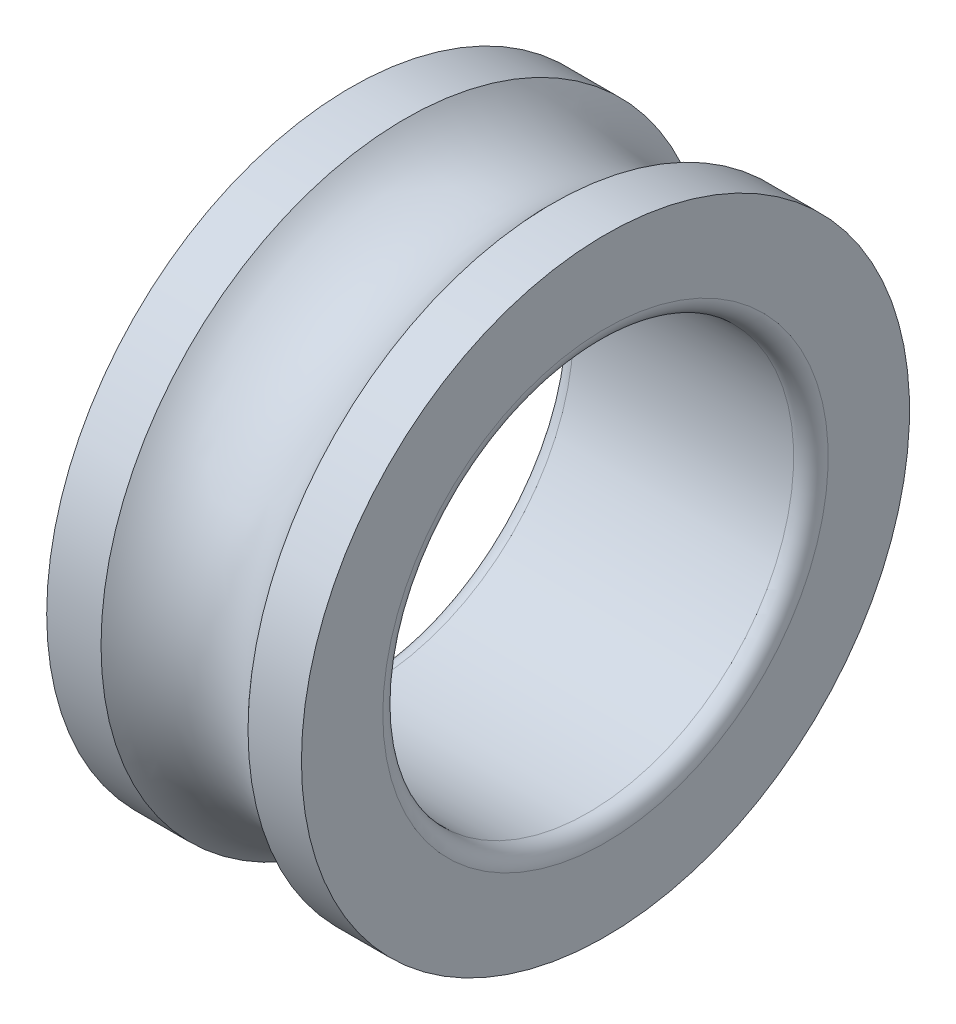
ISO-10303-21;
HEADER;
FILE_DESCRIPTION(('STEP AP214'),'2;1');
FILE_NAME('part.step','',(''),(''),'','','');
FILE_SCHEMA(('AUTOMOTIVE_DESIGN { 1 0 10303 214 1 1 1 1 }'));
ENDSEC;
DATA;
#1=APPLICATION_CONTEXT('core data for automotive mechanical design processes');
#2=APPLICATION_PROTOCOL_DEFINITION('international standard','automotive_design',2000,#1);
#3=PRODUCT_CONTEXT('',#1,'mechanical');
#4=PRODUCT('Part','Part','',(#3));
#5=PRODUCT_RELATED_PRODUCT_CATEGORY('part','',(#4));
#6=PRODUCT_DEFINITION_FORMATION('','',#4);
#7=PRODUCT_DEFINITION_CONTEXT('part definition',#1,'design');
#8=PRODUCT_DEFINITION('design','',#6,#7);
#9=PRODUCT_DEFINITION_SHAPE('','',#8);
#10=(LENGTH_UNIT() NAMED_UNIT(*) SI_UNIT(.MILLI.,.METRE.));
#11=(NAMED_UNIT(*) PLANE_ANGLE_UNIT() SI_UNIT($,.RADIAN.));
#12=(NAMED_UNIT(*) SI_UNIT($,.STERADIAN.) SOLID_ANGLE_UNIT());
#13=UNCERTAINTY_MEASURE_WITH_UNIT(LENGTH_MEASURE(1.E-05),#10,'distance_accuracy_value','');
#14=(GEOMETRIC_REPRESENTATION_CONTEXT(3) GLOBAL_UNCERTAINTY_ASSIGNED_CONTEXT((#13)) GLOBAL_UNIT_ASSIGNED_CONTEXT((#10,
#11,#12)) REPRESENTATION_CONTEXT('',''));
#15=CARTESIAN_POINT('',(0.,0.,0.));
#16=DIRECTION('',(0.,0.,1.));
#17=DIRECTION('',(1.,0.,0.));
#18=AXIS2_PLACEMENT_3D('',#15,#16,#17);
#19=CARTESIAN_POINT('',(-15.5,37.,0.));
#20=DIRECTION('',(1.,0.,0.));
#21=DIRECTION('',(0.,0.,-1.));
#22=AXIS2_PLACEMENT_3D('',#19,#20,#21);
#23=PLANE('',#22);
#24=CARTESIAN_POINT('',(-15.5,0.,0.));
#25=DIRECTION('',(-1.,0.,0.));
#26=DIRECTION('',(0.,0.,1.));
#27=AXIS2_PLACEMENT_3D('',#24,#25,#26);
#28=CIRCLE('',#27,27.1);
#29=CARTESIAN_POINT('',(-15.5,0.,27.1));
#30=VERTEX_POINT('',#29);
#31=EDGE_CURVE('E10',#30,#30,#28,.T.);
#32=ORIENTED_EDGE('',*,*,#31,.F.);
#33=EDGE_LOOP('',(#32));
#34=FACE_BOUND('',#33,.T.);
#35=CARTESIAN_POINT('',(-15.5,0.,0.));
#36=DIRECTION('',(-1.,0.,0.));
#37=DIRECTION('',(0.,0.,1.));
#38=AXIS2_PLACEMENT_3D('',#35,#36,#37);
#39=CIRCLE('',#38,37.);
#40=CARTESIAN_POINT('',(-15.5,0.,37.));
#41=VERTEX_POINT('',#40);
#42=EDGE_CURVE('E67',#41,#41,#39,.T.);
#43=ORIENTED_EDGE('',*,*,#42,.T.);
#44=EDGE_LOOP('',(#43));
#45=FACE_BOUND('',#44,.T.);
#46=ADVANCED_FACE('F39',(#34,#45),#23,.F.);
#47=CARTESIAN_POINT('',(-13.4,0.,0.));
#48=DIRECTION('',(-1.,0.,0.));
#49=DIRECTION('',(0.,0.,1.));
#50=AXIS2_PLACEMENT_3D('',#47,#48,#49);
#51=TOROIDAL_SURFACE('',#50,27.1,2.1);
#52=CARTESIAN_POINT('',(-13.4,0.,0.));
#53=DIRECTION('',(-1.,0.,0.));
#54=DIRECTION('',(0.,0.,1.));
#55=AXIS2_PLACEMENT_3D('',#52,#53,#54);
#56=CIRCLE('',#55,25.);
#57=CARTESIAN_POINT('',(-13.4,0.,25.));
#58=VERTEX_POINT('',#57);
#59=EDGE_CURVE('E45',#58,#58,#56,.T.);
#60=ORIENTED_EDGE('',*,*,#59,.F.);
#61=EDGE_LOOP('',(#60));
#62=FACE_BOUND('',#61,.T.);
#63=ORIENTED_EDGE('',*,*,#31,.T.);
#64=EDGE_LOOP('',(#63));
#65=FACE_BOUND('',#64,.T.);
#66=ADVANCED_FACE('F104',(#62,#65),#51,.T.);
#67=CARTESIAN_POINT('',(-17.7214983713355,0.,0.));
#68=DIRECTION('',(-1.,0.,0.));
#69=DIRECTION('',(0.,0.,1.));
#70=AXIS2_PLACEMENT_3D('',#67,#68,#69);
#71=CYLINDRICAL_SURFACE('',#70,25.);
#72=CARTESIAN_POINT('',(13.4,0.,0.));
#73=DIRECTION('',(-1.,0.,0.));
#74=DIRECTION('',(0.,0.,1.));
#75=AXIS2_PLACEMENT_3D('',#72,#73,#74);
#76=CIRCLE('',#75,25.);
#77=CARTESIAN_POINT('',(13.4,0.,25.));
#78=VERTEX_POINT('',#77);
#79=EDGE_CURVE('E49',#78,#78,#76,.T.);
#80=ORIENTED_EDGE('',*,*,#79,.F.);
#81=EDGE_LOOP('',(#80));
#82=FACE_BOUND('',#81,.T.);
#83=ORIENTED_EDGE('',*,*,#59,.T.);
#84=EDGE_LOOP('',(#83));
#85=FACE_BOUND('',#84,.T.);
#86=ADVANCED_FACE('F99',(#82,#85),#71,.F.);
#87=CARTESIAN_POINT('',(13.4,0.,0.));
#88=DIRECTION('',(-1.,0.,0.));
#89=DIRECTION('',(0.,0.,1.));
#90=AXIS2_PLACEMENT_3D('',#87,#88,#89);
#91=TOROIDAL_SURFACE('',#90,27.1,2.1);
#92=CARTESIAN_POINT('',(15.5,0.,0.));
#93=DIRECTION('',(-1.,0.,0.));
#94=DIRECTION('',(0.,0.,1.));
#95=AXIS2_PLACEMENT_3D('',#92,#93,#94);
#96=CIRCLE('',#95,27.1);
#97=CARTESIAN_POINT('',(15.5,0.,27.1));
#98=VERTEX_POINT('',#97);
#99=EDGE_CURVE('E53',#98,#98,#96,.T.);
#100=ORIENTED_EDGE('',*,*,#99,.F.);
#101=EDGE_LOOP('',(#100));
#102=FACE_BOUND('',#101,.T.);
#103=ORIENTED_EDGE('',*,*,#79,.T.);
#104=EDGE_LOOP('',(#103));
#105=FACE_BOUND('',#104,.T.);
#106=ADVANCED_FACE('F93',(#102,#105),#91,.T.);
#107=CARTESIAN_POINT('',(15.5,37.,0.));
#108=DIRECTION('',(-1.,0.,0.));
#109=DIRECTION('',(0.,0.,1.));
#110=AXIS2_PLACEMENT_3D('',#107,#108,#109);
#111=PLANE('',#110);
#112=CARTESIAN_POINT('',(15.5,0.,0.));
#113=DIRECTION('',(-1.,0.,0.));
#114=DIRECTION('',(0.,0.,1.));
#115=AXIS2_PLACEMENT_3D('',#112,#113,#114);
#116=CIRCLE('',#115,37.);
#117=CARTESIAN_POINT('',(15.5,0.,37.));
#118=VERTEX_POINT('',#117);
#119=EDGE_CURVE('E58',#118,#118,#116,.T.);
#120=ORIENTED_EDGE('',*,*,#119,.F.);
#121=EDGE_LOOP('',(#120));
#122=FACE_BOUND('',#121,.T.);
#123=ORIENTED_EDGE('',*,*,#99,.T.);
#124=EDGE_LOOP('',(#123));
#125=FACE_BOUND('',#124,.T.);
#126=ADVANCED_FACE('F87',(#122,#125),#111,.F.);
#127=CARTESIAN_POINT('',(-17.7214983713355,0.,0.));
#128=DIRECTION('',(-1.,0.,0.));
#129=DIRECTION('',(0.,0.,1.));
#130=AXIS2_PLACEMENT_3D('',#127,#128,#129);
#131=CYLINDRICAL_SURFACE('',#130,37.);
#132=CARTESIAN_POINT('',(9.,0.,0.));
#133=DIRECTION('',(-1.,0.,0.));
#134=DIRECTION('',(0.,0.,1.));
#135=AXIS2_PLACEMENT_3D('',#132,#133,#134);
#136=CIRCLE('',#135,37.);
#137=CARTESIAN_POINT('',(9.,0.,37.));
#138=VERTEX_POINT('',#137);
#139=EDGE_CURVE('E61',#138,#138,#136,.T.);
#140=ORIENTED_EDGE('',*,*,#139,.F.);
#141=EDGE_LOOP('',(#140));
#142=FACE_BOUND('',#141,.T.);
#143=ORIENTED_EDGE('',*,*,#119,.T.);
#144=EDGE_LOOP('',(#143));
#145=FACE_BOUND('',#144,.T.);
#146=ADVANCED_FACE('F81',(#142,#145),#131,.T.);
#147=CARTESIAN_POINT('',(0.0557280900008519,0.,0.));
#148=DIRECTION('',(-1.,0.,0.));
#149=DIRECTION('',(0.,0.,1.));
#150=AXIS2_PLACEMENT_3D('',#147,#148,#149);
#151=TOROIDAL_SURFACE('',#150,45.,12.);
#152=CARTESIAN_POINT('',(-8.8885438199983,0.,0.));
#153=DIRECTION('',(-1.,0.,0.));
#154=DIRECTION('',(0.,0.,1.));
#155=AXIS2_PLACEMENT_3D('',#152,#153,#154);
#156=CIRCLE('',#155,37.);
#157=CARTESIAN_POINT('',(-8.8885438199983,0.,37.));
#158=VERTEX_POINT('',#157);
#159=EDGE_CURVE('E64',#158,#158,#156,.T.);
#160=ORIENTED_EDGE('',*,*,#159,.F.);
#161=EDGE_LOOP('',(#160));
#162=FACE_BOUND('',#161,.T.);
#163=ORIENTED_EDGE('',*,*,#139,.T.);
#164=EDGE_LOOP('',(#163));
#165=FACE_BOUND('',#164,.T.);
#166=ADVANCED_FACE('F75',(#162,#165),#151,.F.);
#167=CARTESIAN_POINT('',(-17.7214983713355,0.,0.));
#168=DIRECTION('',(-1.,0.,0.));
#169=DIRECTION('',(0.,0.,1.));
#170=AXIS2_PLACEMENT_3D('',#167,#168,#169);
#171=CYLINDRICAL_SURFACE('',#170,37.);
#172=ORIENTED_EDGE('',*,*,#42,.F.);
#173=EDGE_LOOP('',(#172));
#174=FACE_BOUND('',#173,.T.);
#175=ORIENTED_EDGE('',*,*,#159,.T.);
#176=EDGE_LOOP('',(#175));
#177=FACE_BOUND('',#176,.T.);
#178=ADVANCED_FACE('F72',(#174,#177),#171,.T.);
#179=CLOSED_SHELL('',(#46,#66,#86,#106,#126,#146,#166,#178));
#180=MANIFOLD_SOLID_BREP('B2',#179);
#181=ADVANCED_BREP_SHAPE_REPRESENTATION('',(#18,#180),#14);
#182=SHAPE_DEFINITION_REPRESENTATION(#9,#181);
ENDSEC;
END-ISO-10303-21;
